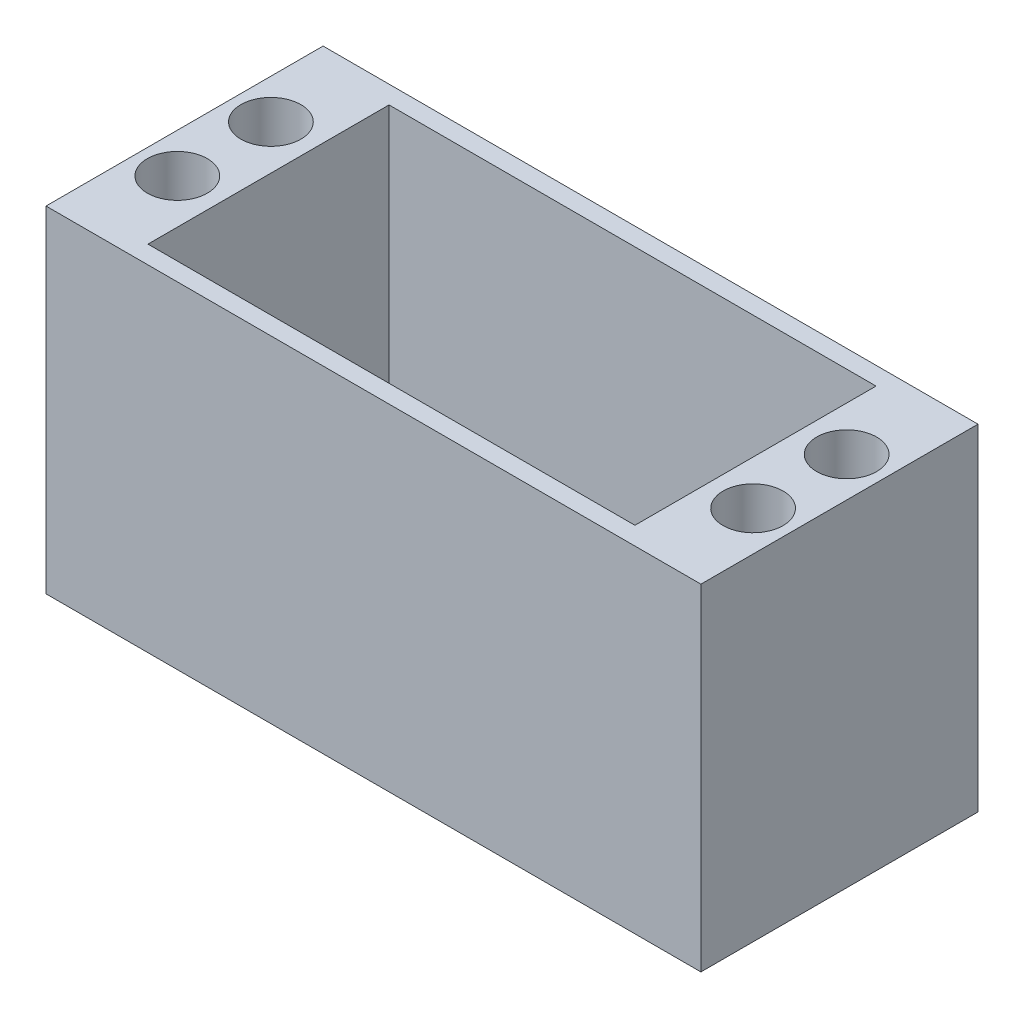
ISO-10303-21;
HEADER;
FILE_DESCRIPTION(('STEP AP214'),'2;1');
FILE_NAME('part.step','',(''),(''),'','','');
FILE_SCHEMA(('AUTOMOTIVE_DESIGN { 1 0 10303 214 1 1 1 1 }'));
ENDSEC;
DATA;
#1=APPLICATION_CONTEXT('core data for automotive mechanical design processes');
#2=APPLICATION_PROTOCOL_DEFINITION('international standard','automotive_design',2000,#1);
#3=PRODUCT_CONTEXT('',#1,'mechanical');
#4=PRODUCT('Part','Part','',(#3));
#5=PRODUCT_RELATED_PRODUCT_CATEGORY('part','',(#4));
#6=PRODUCT_DEFINITION_FORMATION('','',#4);
#7=PRODUCT_DEFINITION_CONTEXT('part definition',#1,'design');
#8=PRODUCT_DEFINITION('design','',#6,#7);
#9=PRODUCT_DEFINITION_SHAPE('','',#8);
#10=(LENGTH_UNIT() NAMED_UNIT(*) SI_UNIT(.MILLI.,.METRE.));
#11=(NAMED_UNIT(*) PLANE_ANGLE_UNIT() SI_UNIT($,.RADIAN.));
#12=(NAMED_UNIT(*) SI_UNIT($,.STERADIAN.) SOLID_ANGLE_UNIT());
#13=UNCERTAINTY_MEASURE_WITH_UNIT(LENGTH_MEASURE(1.E-05),#10,'distance_accuracy_value','');
#14=(GEOMETRIC_REPRESENTATION_CONTEXT(3) GLOBAL_UNCERTAINTY_ASSIGNED_CONTEXT((#13)) GLOBAL_UNIT_ASSIGNED_CONTEXT((#10,
#11,#12)) REPRESENTATION_CONTEXT('',''));
#15=CARTESIAN_POINT('',(0.,0.,0.));
#16=DIRECTION('',(0.,0.,1.));
#17=DIRECTION('',(1.,0.,0.));
#18=AXIS2_PLACEMENT_3D('',#15,#16,#17);
#19=CARTESIAN_POINT('',(0.,28.,0.));
#20=DIRECTION('',(0.,1.,0.));
#21=DIRECTION('',(0.,0.,1.));
#22=AXIS2_PLACEMENT_3D('',#19,#20,#21);
#23=PLANE('',#22);
#24=CARTESIAN_POINT('',(-24.,28.,3.90000000000003));
#25=DIRECTION('',(0.,1.,0.));
#26=DIRECTION('',(0.,0.,1.));
#27=AXIS2_PLACEMENT_3D('',#24,#25,#26);
#28=CIRCLE('',#27,2.49999999999989);
#29=CARTESIAN_POINT('',(-24.,28.,6.39999999999991));
#30=VERTEX_POINT('',#29);
#31=EDGE_CURVE('E292',#30,#30,#28,.T.);
#32=ORIENTED_EDGE('',*,*,#31,.F.);
#33=EDGE_LOOP('',(#32));
#34=FACE_BOUND('',#33,.T.);
#35=CARTESIAN_POINT('',(24.,28.,3.90000000000003));
#36=DIRECTION('',(0.,1.,0.));
#37=DIRECTION('',(0.,0.,1.));
#38=AXIS2_PLACEMENT_3D('',#35,#36,#37);
#39=CIRCLE('',#38,2.49999999999989);
#40=CARTESIAN_POINT('',(24.,28.,6.39999999999991));
#41=VERTEX_POINT('',#40);
#42=EDGE_CURVE('E282',#41,#41,#39,.T.);
#43=ORIENTED_EDGE('',*,*,#42,.F.);
#44=EDGE_LOOP('',(#43));
#45=FACE_BOUND('',#44,.T.);
#46=CARTESIAN_POINT('',(24.,28.,-3.9));
#47=DIRECTION('',(0.,1.,0.));
#48=DIRECTION('',(0.,0.,1.));
#49=AXIS2_PLACEMENT_3D('',#46,#47,#48);
#50=CIRCLE('',#49,2.49999999999989);
#51=CARTESIAN_POINT('',(24.,28.,-1.40000000000011));
#52=VERTEX_POINT('',#51);
#53=EDGE_CURVE('E274',#52,#52,#50,.T.);
#54=ORIENTED_EDGE('',*,*,#53,.F.);
#55=EDGE_LOOP('',(#54));
#56=FACE_BOUND('',#55,.T.);
#57=CARTESIAN_POINT('',(-24.,28.,-3.9));
#58=DIRECTION('',(0.,1.,0.));
#59=DIRECTION('',(0.,0.,1.));
#60=AXIS2_PLACEMENT_3D('',#57,#58,#59);
#61=CIRCLE('',#60,2.49999999999999);
#62=CARTESIAN_POINT('',(-24.,28.,-1.40000000000001));
#63=VERTEX_POINT('',#62);
#64=EDGE_CURVE('E277',#63,#63,#61,.T.);
#65=ORIENTED_EDGE('',*,*,#64,.F.);
#66=EDGE_LOOP('',(#65));
#67=FACE_BOUND('',#66,.T.);
#68=DIRECTION('',(0.,0.,1.));
#69=VECTOR('',#68,1.);
#70=CARTESIAN_POINT('',(-27.3,28.,11.55));
#71=LINE('',#70,#69);
#72=CARTESIAN_POINT('',(-27.3,28.,-11.55));
#73=VERTEX_POINT('',#72);
#74=CARTESIAN_POINT('',(-27.3,28.,11.55));
#75=VERTEX_POINT('',#74);
#76=EDGE_CURVE('E160',#73,#75,#71,.T.);
#77=ORIENTED_EDGE('',*,*,#76,.T.);
#78=DIRECTION('',(1.,0.,0.));
#79=VECTOR('',#78,1.);
#80=CARTESIAN_POINT('',(27.3,28.,11.55));
#81=LINE('',#80,#79);
#82=CARTESIAN_POINT('',(27.3,28.,11.55));
#83=VERTEX_POINT('',#82);
#84=EDGE_CURVE('E164',#75,#83,#81,.T.);
#85=ORIENTED_EDGE('',*,*,#84,.T.);
#86=DIRECTION('',(0.,0.,-1.));
#87=VECTOR('',#86,1.);
#88=CARTESIAN_POINT('',(27.3,28.,11.55));
#89=LINE('',#88,#87);
#90=CARTESIAN_POINT('',(27.3,28.,-11.55));
#91=VERTEX_POINT('',#90);
#92=EDGE_CURVE('E168',#83,#91,#89,.T.);
#93=ORIENTED_EDGE('',*,*,#92,.T.);
#94=DIRECTION('',(-1.,0.,0.));
#95=VECTOR('',#94,1.);
#96=CARTESIAN_POINT('',(27.3,28.,-11.55));
#97=LINE('',#96,#95);
#98=EDGE_CURVE('E171',#91,#73,#97,.T.);
#99=ORIENTED_EDGE('',*,*,#98,.T.);
#100=EDGE_LOOP('',(#77,#85,#93,#99));
#101=FACE_BOUND('',#100,.T.);
#102=DIRECTION('',(-1.,0.,0.));
#103=VECTOR('',#102,1.);
#104=CARTESIAN_POINT('',(-20.3,28.,-10.05));
#105=LINE('',#104,#103);
#106=CARTESIAN_POINT('',(20.3,28.,-10.05));
#107=VERTEX_POINT('',#106);
#108=CARTESIAN_POINT('',(-20.3,28.,-10.05));
#109=VERTEX_POINT('',#108);
#110=EDGE_CURVE('E119',#107,#109,#105,.T.);
#111=ORIENTED_EDGE('',*,*,#110,.F.);
#112=DIRECTION('',(0.,0.,-1.));
#113=VECTOR('',#112,1.);
#114=CARTESIAN_POINT('',(20.3,28.,-10.05));
#115=LINE('',#114,#113);
#116=CARTESIAN_POINT('',(20.3,28.,10.05));
#117=VERTEX_POINT('',#116);
#118=EDGE_CURVE('E110',#117,#107,#115,.T.);
#119=ORIENTED_EDGE('',*,*,#118,.F.);
#120=DIRECTION('',(1.,0.,0.));
#121=VECTOR('',#120,1.);
#122=CARTESIAN_POINT('',(-20.3,28.,10.05));
#123=LINE('',#122,#121);
#124=CARTESIAN_POINT('',(-20.3,28.,10.05));
#125=VERTEX_POINT('',#124);
#126=EDGE_CURVE('E136',#125,#117,#123,.T.);
#127=ORIENTED_EDGE('',*,*,#126,.F.);
#128=DIRECTION('',(0.,0.,1.));
#129=VECTOR('',#128,1.);
#130=CARTESIAN_POINT('',(-20.3,28.,-10.05));
#131=LINE('',#130,#129);
#132=EDGE_CURVE('E132',#109,#125,#131,.T.);
#133=ORIENTED_EDGE('',*,*,#132,.F.);
#134=EDGE_LOOP('',(#111,#119,#127,#133));
#135=FACE_BOUND('',#134,.T.);
#136=ADVANCED_FACE('F44',(#34,#45,#56,#67,#101,#135),#23,.T.);
#137=CARTESIAN_POINT('',(0.,0.,0.));
#138=DIRECTION('',(0.,1.,0.));
#139=DIRECTION('',(0.,0.,1.));
#140=AXIS2_PLACEMENT_3D('',#137,#138,#139);
#141=PLANE('',#140);
#142=CARTESIAN_POINT('',(-24.,0.,3.90000000000003));
#143=DIRECTION('',(0.,1.,0.));
#144=DIRECTION('',(0.,0.,1.));
#145=AXIS2_PLACEMENT_3D('',#142,#143,#144);
#146=CIRCLE('',#145,2.49999999999989);
#147=CARTESIAN_POINT('',(-24.,0.,6.39999999999991));
#148=VERTEX_POINT('',#147);
#149=EDGE_CURVE('E296',#148,#148,#146,.T.);
#150=ORIENTED_EDGE('',*,*,#149,.T.);
#151=EDGE_LOOP('',(#150));
#152=FACE_BOUND('',#151,.T.);
#153=CARTESIAN_POINT('',(24.,0.,3.90000000000003));
#154=DIRECTION('',(0.,1.,0.));
#155=DIRECTION('',(0.,0.,1.));
#156=AXIS2_PLACEMENT_3D('',#153,#154,#155);
#157=CIRCLE('',#156,2.49999999999989);
#158=CARTESIAN_POINT('',(24.,0.,6.39999999999991));
#159=VERTEX_POINT('',#158);
#160=EDGE_CURVE('E288',#159,#159,#157,.T.);
#161=ORIENTED_EDGE('',*,*,#160,.T.);
#162=EDGE_LOOP('',(#161));
#163=FACE_BOUND('',#162,.T.);
#164=CARTESIAN_POINT('',(24.,0.,-3.9));
#165=DIRECTION('',(0.,1.,0.));
#166=DIRECTION('',(0.,0.,1.));
#167=AXIS2_PLACEMENT_3D('',#164,#165,#166);
#168=CIRCLE('',#167,2.49999999999989);
#169=CARTESIAN_POINT('',(24.,0.,-1.40000000000011));
#170=VERTEX_POINT('',#169);
#171=EDGE_CURVE('E271',#170,#170,#168,.T.);
#172=ORIENTED_EDGE('',*,*,#171,.T.);
#173=EDGE_LOOP('',(#172));
#174=FACE_BOUND('',#173,.T.);
#175=CARTESIAN_POINT('',(-24.,0.,-3.9));
#176=DIRECTION('',(0.,1.,0.));
#177=DIRECTION('',(0.,0.,1.));
#178=AXIS2_PLACEMENT_3D('',#175,#176,#177);
#179=CIRCLE('',#178,2.49999999999999);
#180=CARTESIAN_POINT('',(-24.,0.,-1.40000000000001));
#181=VERTEX_POINT('',#180);
#182=EDGE_CURVE('E144',#181,#181,#179,.T.);
#183=ORIENTED_EDGE('',*,*,#182,.T.);
#184=EDGE_LOOP('',(#183));
#185=FACE_BOUND('',#184,.T.);
#186=DIRECTION('',(0.,0.,1.));
#187=VECTOR('',#186,1.);
#188=CARTESIAN_POINT('',(-27.3,0.,11.55));
#189=LINE('',#188,#187);
#190=CARTESIAN_POINT('',(-27.3,0.,-11.55));
#191=VERTEX_POINT('',#190);
#192=CARTESIAN_POINT('',(-27.3,0.,11.55));
#193=VERTEX_POINT('',#192);
#194=EDGE_CURVE('E128',#191,#193,#189,.T.);
#195=ORIENTED_EDGE('',*,*,#194,.F.);
#196=DIRECTION('',(-1.,0.,0.));
#197=VECTOR('',#196,1.);
#198=CARTESIAN_POINT('',(27.3,0.,-11.55));
#199=LINE('',#198,#197);
#200=CARTESIAN_POINT('',(27.3,0.,-11.55));
#201=VERTEX_POINT('',#200);
#202=EDGE_CURVE('E165',#201,#191,#199,.T.);
#203=ORIENTED_EDGE('',*,*,#202,.F.);
#204=DIRECTION('',(0.,0.,-1.));
#205=VECTOR('',#204,1.);
#206=CARTESIAN_POINT('',(27.3,0.,11.55));
#207=LINE('',#206,#205);
#208=CARTESIAN_POINT('',(27.3,0.,11.55));
#209=VERTEX_POINT('',#208);
#210=EDGE_CURVE('E181',#209,#201,#207,.T.);
#211=ORIENTED_EDGE('',*,*,#210,.F.);
#212=DIRECTION('',(1.,0.,0.));
#213=VECTOR('',#212,1.);
#214=CARTESIAN_POINT('',(27.3,0.,11.55));
#215=LINE('',#214,#213);
#216=EDGE_CURVE('E178',#193,#209,#215,.T.);
#217=ORIENTED_EDGE('',*,*,#216,.F.);
#218=EDGE_LOOP('',(#195,#203,#211,#217));
#219=FACE_BOUND('',#218,.T.);
#220=DIRECTION('',(0.,0.,-1.));
#221=VECTOR('',#220,1.);
#222=CARTESIAN_POINT('',(20.3,0.,-10.05));
#223=LINE('',#222,#221);
#224=CARTESIAN_POINT('',(20.3,0.,10.05));
#225=VERTEX_POINT('',#224);
#226=CARTESIAN_POINT('',(20.3,0.,-10.05));
#227=VERTEX_POINT('',#226);
#228=EDGE_CURVE('E68',#225,#227,#223,.T.);
#229=ORIENTED_EDGE('',*,*,#228,.T.);
#230=DIRECTION('',(-1.,0.,0.));
#231=VECTOR('',#230,1.);
#232=CARTESIAN_POINT('',(-20.3,0.,-10.05));
#233=LINE('',#232,#231);
#234=CARTESIAN_POINT('',(-20.3,0.,-10.05));
#235=VERTEX_POINT('',#234);
#236=EDGE_CURVE('E126',#227,#235,#233,.T.);
#237=ORIENTED_EDGE('',*,*,#236,.T.);
#238=DIRECTION('',(0.,0.,1.));
#239=VECTOR('',#238,1.);
#240=CARTESIAN_POINT('',(-20.3,0.,-10.05));
#241=LINE('',#240,#239);
#242=CARTESIAN_POINT('',(-20.3,0.,10.05));
#243=VERTEX_POINT('',#242);
#244=EDGE_CURVE('E147',#235,#243,#241,.T.);
#245=ORIENTED_EDGE('',*,*,#244,.T.);
#246=DIRECTION('',(1.,0.,0.));
#247=VECTOR('',#246,1.);
#248=CARTESIAN_POINT('',(-20.3,0.,10.05));
#249=LINE('',#248,#247);
#250=EDGE_CURVE('E120',#243,#225,#249,.T.);
#251=ORIENTED_EDGE('',*,*,#250,.T.);
#252=EDGE_LOOP('',(#229,#237,#245,#251));
#253=FACE_BOUND('',#252,.T.);
#254=ADVANCED_FACE('F204',(#152,#163,#174,#185,#219,#253),#141,.F.);
#255=CARTESIAN_POINT('',(-27.3,28.,11.55));
#256=DIRECTION('',(1.,0.,0.));
#257=DIRECTION('',(0.,0.,-1.));
#258=AXIS2_PLACEMENT_3D('',#255,#256,#257);
#259=PLANE('',#258);
#260=ORIENTED_EDGE('',*,*,#194,.T.);
#261=DIRECTION('',(0.,-1.,0.));
#262=VECTOR('',#261,1.);
#263=CARTESIAN_POINT('',(-27.3,28.,11.55));
#264=LINE('',#263,#262);
#265=EDGE_CURVE('E11',#75,#193,#264,.T.);
#266=ORIENTED_EDGE('',*,*,#265,.F.);
#267=ORIENTED_EDGE('',*,*,#76,.F.);
#268=DIRECTION('',(0.,-1.,0.));
#269=VECTOR('',#268,1.);
#270=CARTESIAN_POINT('',(-27.3,28.,-11.55));
#271=LINE('',#270,#269);
#272=EDGE_CURVE('E174',#73,#191,#271,.T.);
#273=ORIENTED_EDGE('',*,*,#272,.T.);
#274=EDGE_LOOP('',(#260,#266,#267,#273));
#275=FACE_BOUND('',#274,.T.);
#276=ADVANCED_FACE('F46',(#275),#259,.F.);
#277=CARTESIAN_POINT('',(27.3,28.,11.55));
#278=DIRECTION('',(0.,0.,-1.));
#279=DIRECTION('',(-1.,0.,0.));
#280=AXIS2_PLACEMENT_3D('',#277,#278,#279);
#281=PLANE('',#280);
#282=ORIENTED_EDGE('',*,*,#216,.T.);
#283=DIRECTION('',(0.,-1.,0.));
#284=VECTOR('',#283,1.);
#285=CARTESIAN_POINT('',(27.3,28.,11.55));
#286=LINE('',#285,#284);
#287=EDGE_CURVE('E53',#83,#209,#286,.T.);
#288=ORIENTED_EDGE('',*,*,#287,.F.);
#289=ORIENTED_EDGE('',*,*,#84,.F.);
#290=ORIENTED_EDGE('',*,*,#265,.T.);
#291=EDGE_LOOP('',(#282,#288,#289,#290));
#292=FACE_BOUND('',#291,.T.);
#293=ADVANCED_FACE('F214',(#292),#281,.F.);
#294=CARTESIAN_POINT('',(27.3,28.,11.55));
#295=DIRECTION('',(-1.,0.,0.));
#296=DIRECTION('',(0.,0.,1.));
#297=AXIS2_PLACEMENT_3D('',#294,#295,#296);
#298=PLANE('',#297);
#299=ORIENTED_EDGE('',*,*,#210,.T.);
#300=DIRECTION('',(0.,-1.,0.));
#301=VECTOR('',#300,1.);
#302=CARTESIAN_POINT('',(27.3,28.,-11.55));
#303=LINE('',#302,#301);
#304=EDGE_CURVE('E189',#91,#201,#303,.T.);
#305=ORIENTED_EDGE('',*,*,#304,.F.);
#306=ORIENTED_EDGE('',*,*,#92,.F.);
#307=ORIENTED_EDGE('',*,*,#287,.T.);
#308=EDGE_LOOP('',(#299,#305,#306,#307));
#309=FACE_BOUND('',#308,.T.);
#310=ADVANCED_FACE('F198',(#309),#298,.F.);
#311=CARTESIAN_POINT('',(27.3,28.,-11.55));
#312=DIRECTION('',(0.,0.,1.));
#313=DIRECTION('',(1.,0.,0.));
#314=AXIS2_PLACEMENT_3D('',#311,#312,#313);
#315=PLANE('',#314);
#316=ORIENTED_EDGE('',*,*,#202,.T.);
#317=ORIENTED_EDGE('',*,*,#272,.F.);
#318=ORIENTED_EDGE('',*,*,#98,.F.);
#319=ORIENTED_EDGE('',*,*,#304,.T.);
#320=EDGE_LOOP('',(#316,#317,#318,#319));
#321=FACE_BOUND('',#320,.T.);
#322=ADVANCED_FACE('F208',(#321),#315,.F.);
#323=CARTESIAN_POINT('',(20.3,28.,-10.05));
#324=DIRECTION('',(-1.,0.,0.));
#325=DIRECTION('',(0.,0.,1.));
#326=AXIS2_PLACEMENT_3D('',#323,#324,#325);
#327=PLANE('',#326);
#328=ORIENTED_EDGE('',*,*,#228,.F.);
#329=DIRECTION('',(0.,-1.,0.));
#330=VECTOR('',#329,1.);
#331=CARTESIAN_POINT('',(20.3,28.,10.05));
#332=LINE('',#331,#330);
#333=EDGE_CURVE('E114',#117,#225,#332,.T.);
#334=ORIENTED_EDGE('',*,*,#333,.F.);
#335=ORIENTED_EDGE('',*,*,#118,.T.);
#336=DIRECTION('',(0.,-1.,0.));
#337=VECTOR('',#336,1.);
#338=CARTESIAN_POINT('',(20.3,28.,-10.05));
#339=LINE('',#338,#337);
#340=EDGE_CURVE('E113',#107,#227,#339,.T.);
#341=ORIENTED_EDGE('',*,*,#340,.T.);
#342=EDGE_LOOP('',(#328,#334,#335,#341));
#343=FACE_BOUND('',#342,.T.);
#344=ADVANCED_FACE('F112',(#343),#327,.T.);
#345=CARTESIAN_POINT('',(-20.3,28.,-10.05));
#346=DIRECTION('',(0.,0.,1.));
#347=DIRECTION('',(1.,0.,0.));
#348=AXIS2_PLACEMENT_3D('',#345,#346,#347);
#349=PLANE('',#348);
#350=ORIENTED_EDGE('',*,*,#236,.F.);
#351=ORIENTED_EDGE('',*,*,#340,.F.);
#352=ORIENTED_EDGE('',*,*,#110,.T.);
#353=DIRECTION('',(0.,-1.,0.));
#354=VECTOR('',#353,1.);
#355=CARTESIAN_POINT('',(-20.3,28.,-10.05));
#356=LINE('',#355,#354);
#357=EDGE_CURVE('E129',#109,#235,#356,.T.);
#358=ORIENTED_EDGE('',*,*,#357,.T.);
#359=EDGE_LOOP('',(#350,#351,#352,#358));
#360=FACE_BOUND('',#359,.T.);
#361=ADVANCED_FACE('F123',(#360),#349,.T.);
#362=CARTESIAN_POINT('',(-20.3,28.,-10.05));
#363=DIRECTION('',(1.,0.,0.));
#364=DIRECTION('',(0.,0.,-1.));
#365=AXIS2_PLACEMENT_3D('',#362,#363,#364);
#366=PLANE('',#365);
#367=ORIENTED_EDGE('',*,*,#244,.F.);
#368=ORIENTED_EDGE('',*,*,#357,.F.);
#369=ORIENTED_EDGE('',*,*,#132,.T.);
#370=DIRECTION('',(0.,-1.,0.));
#371=VECTOR('',#370,1.);
#372=CARTESIAN_POINT('',(-20.3,28.,10.05));
#373=LINE('',#372,#371);
#374=EDGE_CURVE('E60',#125,#243,#373,.T.);
#375=ORIENTED_EDGE('',*,*,#374,.T.);
#376=EDGE_LOOP('',(#367,#368,#369,#375));
#377=FACE_BOUND('',#376,.T.);
#378=ADVANCED_FACE('F242',(#377),#366,.T.);
#379=CARTESIAN_POINT('',(-20.3,28.,10.05));
#380=DIRECTION('',(0.,0.,-1.));
#381=DIRECTION('',(-1.,0.,0.));
#382=AXIS2_PLACEMENT_3D('',#379,#380,#381);
#383=PLANE('',#382);
#384=ORIENTED_EDGE('',*,*,#250,.F.);
#385=ORIENTED_EDGE('',*,*,#374,.F.);
#386=ORIENTED_EDGE('',*,*,#126,.T.);
#387=ORIENTED_EDGE('',*,*,#333,.T.);
#388=EDGE_LOOP('',(#384,#385,#386,#387));
#389=FACE_BOUND('',#388,.T.);
#390=ADVANCED_FACE('F246',(#389),#383,.T.);
#391=CARTESIAN_POINT('',(-24.,0.,-3.9));
#392=DIRECTION('',(0.,1.,0.));
#393=DIRECTION('',(0.,0.,1.));
#394=AXIS2_PLACEMENT_3D('',#391,#392,#393);
#395=CYLINDRICAL_SURFACE('',#394,2.49999999999999);
#396=ORIENTED_EDGE('',*,*,#182,.F.);
#397=EDGE_LOOP('',(#396));
#398=FACE_BOUND('',#397,.T.);
#399=ORIENTED_EDGE('',*,*,#64,.T.);
#400=EDGE_LOOP('',(#399));
#401=FACE_BOUND('',#400,.T.);
#402=ADVANCED_FACE('F251',(#398,#401),#395,.F.);
#403=CARTESIAN_POINT('',(24.,0.,-3.9));
#404=DIRECTION('',(0.,1.,0.));
#405=DIRECTION('',(0.,0.,1.));
#406=AXIS2_PLACEMENT_3D('',#403,#404,#405);
#407=CYLINDRICAL_SURFACE('',#406,2.49999999999989);
#408=ORIENTED_EDGE('',*,*,#171,.F.);
#409=EDGE_LOOP('',(#408));
#410=FACE_BOUND('',#409,.T.);
#411=ORIENTED_EDGE('',*,*,#53,.T.);
#412=EDGE_LOOP('',(#411));
#413=FACE_BOUND('',#412,.T.);
#414=ADVANCED_FACE('F254',(#410,#413),#407,.F.);
#415=CARTESIAN_POINT('',(24.,0.,3.90000000000003));
#416=DIRECTION('',(0.,1.,0.));
#417=DIRECTION('',(0.,0.,1.));
#418=AXIS2_PLACEMENT_3D('',#415,#416,#417);
#419=CYLINDRICAL_SURFACE('',#418,2.49999999999989);
#420=ORIENTED_EDGE('',*,*,#160,.F.);
#421=EDGE_LOOP('',(#420));
#422=FACE_BOUND('',#421,.T.);
#423=ORIENTED_EDGE('',*,*,#42,.T.);
#424=EDGE_LOOP('',(#423));
#425=FACE_BOUND('',#424,.T.);
#426=ADVANCED_FACE('F259',(#422,#425),#419,.F.);
#427=CARTESIAN_POINT('',(-24.,0.,3.90000000000003));
#428=DIRECTION('',(0.,1.,0.));
#429=DIRECTION('',(0.,0.,1.));
#430=AXIS2_PLACEMENT_3D('',#427,#428,#429);
#431=CYLINDRICAL_SURFACE('',#430,2.49999999999989);
#432=ORIENTED_EDGE('',*,*,#149,.F.);
#433=EDGE_LOOP('',(#432));
#434=FACE_BOUND('',#433,.T.);
#435=ORIENTED_EDGE('',*,*,#31,.T.);
#436=EDGE_LOOP('',(#435));
#437=FACE_BOUND('',#436,.T.);
#438=ADVANCED_FACE('F256',(#434,#437),#431,.F.);
#439=CLOSED_SHELL('',(#136,#254,#276,#293,#310,#322,#344,#361,#378,#390,#402,#414,#426,#438));
#440=MANIFOLD_SOLID_BREP('B2',#439);
#441=ADVANCED_BREP_SHAPE_REPRESENTATION('',(#18,#440),#14);
#442=SHAPE_DEFINITION_REPRESENTATION(#9,#441);
ENDSEC;
END-ISO-10303-21;
